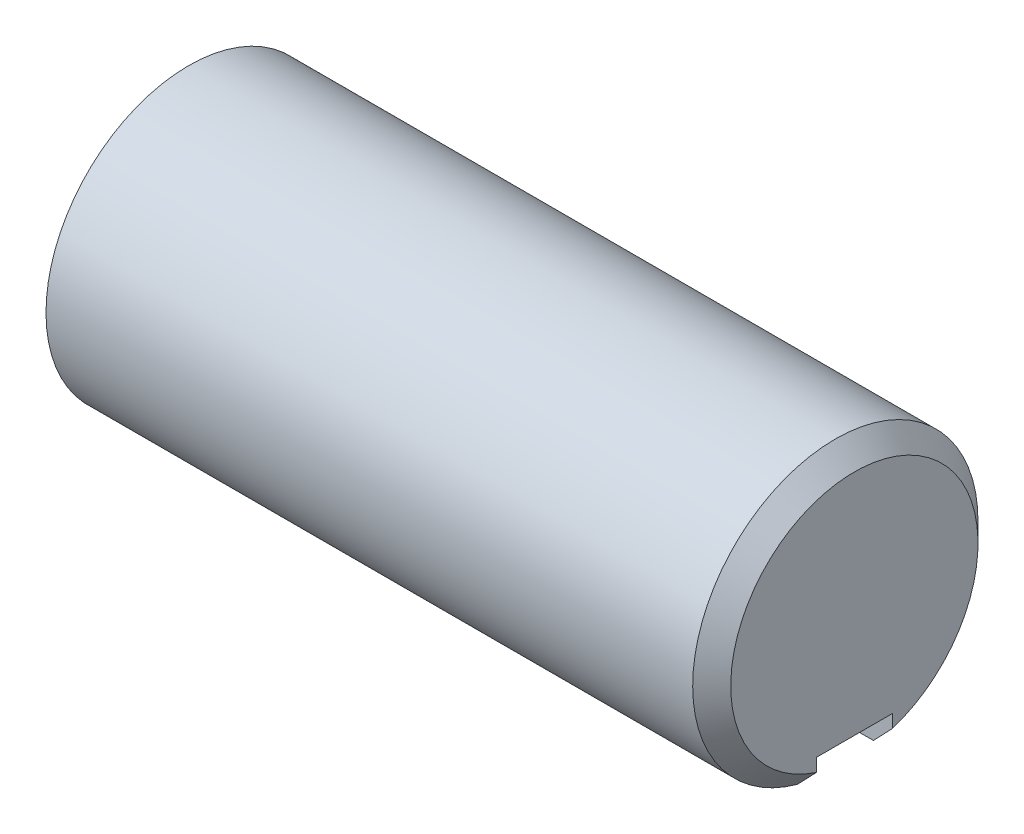
ISO-10303-21;
HEADER;
FILE_DESCRIPTION(('STEP AP214'),'2;1');
FILE_NAME('part.step','',(''),(''),'','','');
FILE_SCHEMA(('AUTOMOTIVE_DESIGN { 1 0 10303 214 1 1 1 1 }'));
ENDSEC;
DATA;
#1=APPLICATION_CONTEXT('core data for automotive mechanical design processes');
#2=APPLICATION_PROTOCOL_DEFINITION('international standard','automotive_design',2000,#1);
#3=PRODUCT_CONTEXT('',#1,'mechanical');
#4=PRODUCT('Part','Part','',(#3));
#5=PRODUCT_RELATED_PRODUCT_CATEGORY('part','',(#4));
#6=PRODUCT_DEFINITION_FORMATION('','',#4);
#7=PRODUCT_DEFINITION_CONTEXT('part definition',#1,'design');
#8=PRODUCT_DEFINITION('design','',#6,#7);
#9=PRODUCT_DEFINITION_SHAPE('','',#8);
#10=(LENGTH_UNIT() NAMED_UNIT(*) SI_UNIT(.MILLI.,.METRE.));
#11=(NAMED_UNIT(*) PLANE_ANGLE_UNIT() SI_UNIT($,.RADIAN.));
#12=(NAMED_UNIT(*) SI_UNIT($,.STERADIAN.) SOLID_ANGLE_UNIT());
#13=UNCERTAINTY_MEASURE_WITH_UNIT(LENGTH_MEASURE(1.E-05),#10,'distance_accuracy_value','');
#14=(GEOMETRIC_REPRESENTATION_CONTEXT(3) GLOBAL_UNCERTAINTY_ASSIGNED_CONTEXT((#13)) GLOBAL_UNIT_ASSIGNED_CONTEXT((#10,
#11,#12)) REPRESENTATION_CONTEXT('',''));
#15=CARTESIAN_POINT('',(0.,0.,0.));
#16=DIRECTION('',(0.,0.,1.));
#17=DIRECTION('',(1.,0.,0.));
#18=AXIS2_PLACEMENT_3D('',#15,#16,#17);
#19=CARTESIAN_POINT('',(432.152262189072,977.174064808057,20.));
#20=DIRECTION('',(1.,0.,0.));
#21=DIRECTION('',(0.,0.,1.));
#22=AXIS2_PLACEMENT_3D('',#19,#20,#21);
#23=PLANE('',#22);
#24=CARTESIAN_POINT('',(432.152262189072,978.254901583344,20.));
#25=DIRECTION('',(1.,0.,0.));
#26=DIRECTION('',(0.,-0.963788819653397,0.266666666666666));
#27=AXIS2_PLACEMENT_3D('',#24,#25,#26);
#28=CIRCLE('',#27,15.);
#29=CARTESIAN_POINT('',(432.152262189072,963.798069288543,24.));
#30=VERTEX_POINT('',#29);
#31=EDGE_CURVE('E11',#30,#30,#28,.T.);
#32=ORIENTED_EDGE('',*,*,#31,.F.);
#33=EDGE_LOOP('',(#32));
#34=FACE_BOUND('',#33,.T.);
#35=ADVANCED_FACE('F42',(#34),#23,.F.);
#36=CARTESIAN_POINT('',(432.152262189072,978.254901583344,20.));
#37=DIRECTION('',(-1.,0.,0.));
#38=DIRECTION('',(0.,-0.963788819653397,-0.266666666666669));
#39=AXIS2_PLACEMENT_3D('',#36,#37,#38);
#40=CYLINDRICAL_SURFACE('',#39,15.);
#41=ORIENTED_EDGE('',*,*,#31,.T.);
#42=EDGE_LOOP('',(#41));
#43=FACE_BOUND('',#42,.T.);
#44=CARTESIAN_POINT('',(500.152262189073,978.254901583344,20.));
#45=DIRECTION('',(1.,0.,0.));
#46=DIRECTION('',(0.,0.963788819653397,0.266666666666669));
#47=AXIS2_PLACEMENT_3D('',#44,#45,#46);
#48=CIRCLE('',#47,15.);
#49=CARTESIAN_POINT('',(500.152262189073,963.798069288543,16.));
#50=VERTEX_POINT('',#49);
#51=CARTESIAN_POINT('',(500.152262189073,963.798069288543,24.));
#52=VERTEX_POINT('',#51);
#53=EDGE_CURVE('E46',#50,#52,#48,.T.);
#54=ORIENTED_EDGE('',*,*,#53,.F.);
#55=DIRECTION('',(1.,0.,0.));
#56=VECTOR('',#55,1.);
#57=CARTESIAN_POINT('',(432.152262189072,963.798069288543,16.));
#58=LINE('',#57,#56);
#59=CARTESIAN_POINT('',(452.152262189073,963.798069288543,16.));
#60=VERTEX_POINT('',#59);
#61=EDGE_CURVE('E136',#60,#50,#58,.T.);
#62=ORIENTED_EDGE('',*,*,#61,.F.);
#63=CARTESIAN_POINT('',(452.152262189073,978.254901583344,20.));
#64=DIRECTION('',(1.,0.,0.));
#65=DIRECTION('',(0.,-0.963788819653397,0.266666666666666));
#66=AXIS2_PLACEMENT_3D('',#63,#64,#65);
#67=CIRCLE('',#66,15.);
#68=CARTESIAN_POINT('',(452.152262189073,963.798069288543,24.));
#69=VERTEX_POINT('',#68);
#70=EDGE_CURVE('E115',#69,#60,#67,.T.);
#71=ORIENTED_EDGE('',*,*,#70,.F.);
#72=DIRECTION('',(1.,0.,0.));
#73=VECTOR('',#72,1.);
#74=CARTESIAN_POINT('',(432.152262189072,963.798069288543,24.));
#75=LINE('',#74,#73);
#76=EDGE_CURVE('E52',#69,#52,#75,.T.);
#77=ORIENTED_EDGE('',*,*,#76,.T.);
#78=EDGE_LOOP('',(#54,#62,#71,#77));
#79=FACE_BOUND('',#78,.T.);
#80=ADVANCED_FACE('F44',(#43,#79),#40,.T.);
#81=CARTESIAN_POINT('',(432.152262189072,967.254901583344,24.));
#82=DIRECTION('',(0.,-1.,0.));
#83=DIRECTION('',(0.,0.,-1.));
#84=AXIS2_PLACEMENT_3D('',#81,#82,#83);
#85=PLANE('',#84);
#86=DIRECTION('',(0.,0.,1.));
#87=VECTOR('',#86,1.);
#88=CARTESIAN_POINT('',(454.152262189073,967.254901583344,22.));
#89=LINE('',#88,#87);
#90=CARTESIAN_POINT('',(454.152262189073,967.254901583344,16.));
#91=VERTEX_POINT('',#90);
#92=CARTESIAN_POINT('',(454.152262189073,967.254901583344,24.));
#93=VERTEX_POINT('',#92);
#94=EDGE_CURVE('E147',#91,#93,#89,.T.);
#95=ORIENTED_EDGE('',*,*,#94,.F.);
#96=DIRECTION('',(1.,0.,0.));
#97=VECTOR('',#96,1.);
#98=CARTESIAN_POINT('',(432.152262189072,967.254901583344,16.));
#99=LINE('',#98,#97);
#100=CARTESIAN_POINT('',(502.152262189073,967.254901583344,16.));
#101=VERTEX_POINT('',#100);
#102=EDGE_CURVE('E129',#91,#101,#99,.T.);
#103=ORIENTED_EDGE('',*,*,#102,.T.);
#104=DIRECTION('',(0.,0.,-1.));
#105=VECTOR('',#104,1.);
#106=CARTESIAN_POINT('',(502.152262189073,967.254901583344,24.));
#107=LINE('',#106,#105);
#108=CARTESIAN_POINT('',(502.152262189073,967.254901583344,24.));
#109=VERTEX_POINT('',#108);
#110=EDGE_CURVE('E102',#109,#101,#107,.T.);
#111=ORIENTED_EDGE('',*,*,#110,.F.);
#112=DIRECTION('',(1.,0.,0.));
#113=VECTOR('',#112,1.);
#114=CARTESIAN_POINT('',(432.152262189072,967.254901583344,24.));
#115=LINE('',#114,#113);
#116=EDGE_CURVE('E99',#93,#109,#115,.T.);
#117=ORIENTED_EDGE('',*,*,#116,.F.);
#118=EDGE_LOOP('',(#95,#103,#111,#117));
#119=FACE_BOUND('',#118,.T.);
#120=ADVANCED_FACE('F170',(#119),#85,.T.);
#121=CARTESIAN_POINT('',(432.152262189072,963.798069288543,24.));
#122=DIRECTION('',(0.,0.,-1.));
#123=DIRECTION('',(0.,1.,0.));
#124=AXIS2_PLACEMENT_3D('',#121,#122,#123);
#125=PLANE('',#124);
#126=CARTESIAN_POINT('',(454.152262189073,965.254901583344,24.));
#127=DIRECTION('',(0.,0.,-1.));
#128=DIRECTION('',(-0.707106781186548,0.707106781186548,0.));
#129=AXIS2_PLACEMENT_3D('',#126,#127,#128);
#130=CIRCLE('',#129,2.);
#131=CARTESIAN_POINT('',(452.152262189073,965.254901583344,24.));
#132=VERTEX_POINT('',#131);
#133=EDGE_CURVE('E123',#132,#93,#130,.T.);
#134=ORIENTED_EDGE('',*,*,#133,.T.);
#135=ORIENTED_EDGE('',*,*,#116,.T.);
#136=DIRECTION('',(0.,1.,0.));
#137=VECTOR('',#136,1.);
#138=CARTESIAN_POINT('',(502.152262189073,963.798069288543,24.));
#139=LINE('',#138,#137);
#140=CARTESIAN_POINT('',(502.152262189073,965.885584706491,24.));
#141=VERTEX_POINT('',#140);
#142=EDGE_CURVE('E93',#141,#109,#139,.T.);
#143=ORIENTED_EDGE('',*,*,#142,.F.);
#144=CARTESIAN_POINT('',(500.152262189073,963.798069288544,24.));
#145=CARTESIAN_POINT('',(501.230078628713,964.916381119582,24.));
#146=CARTESIAN_POINT('',(502.152262189073,965.885584706491,24.));
#147=(BOUNDED_CURVE() B_SPLINE_CURVE(2,(#144,#145,#146),.UNSPECIFIED.,.F.,
.F.) B_SPLINE_CURVE_WITH_KNOTS((3,3),(64.9361637614732,71.0682518353248),
.UNSPECIFIED.) CURVE() GEOMETRIC_REPRESENTATION_ITEM() RATIONAL_B_SPLINE_CURVE((1.05332774941701,
1.02918181261292,1.)) REPRESENTATION_ITEM(''));
#148=EDGE_CURVE('E98',#52,#141,#147,.T.);
#149=ORIENTED_EDGE('',*,*,#148,.F.);
#150=ORIENTED_EDGE('',*,*,#76,.F.);
#151=DIRECTION('',(0.,1.,0.));
#152=VECTOR('',#151,1.);
#153=CARTESIAN_POINT('',(452.152262189073,964.689275071157,24.));
#154=LINE('',#153,#152);
#155=EDGE_CURVE('E117',#69,#132,#154,.T.);
#156=ORIENTED_EDGE('',*,*,#155,.T.);
#157=EDGE_LOOP('',(#134,#135,#143,#149,#150,#156));
#158=FACE_BOUND('',#157,.T.);
#159=ADVANCED_FACE('F96',(#158),#125,.T.);
#160=CARTESIAN_POINT('',(502.152262189073,977.174064808057,20.));
#161=DIRECTION('',(1.,0.,0.));
#162=DIRECTION('',(0.,0.,1.));
#163=AXIS2_PLACEMENT_3D('',#160,#161,#162);
#164=PLANE('',#163);
#165=CARTESIAN_POINT('',(502.152262189073,978.254901583344,20.));
#166=DIRECTION('',(-1.,0.,0.));
#167=DIRECTION('',(0.,0.963788819653397,0.266666666666669));
#168=AXIS2_PLACEMENT_3D('',#165,#166,#167);
#169=CIRCLE('',#168,13.);
#170=CARTESIAN_POINT('',(502.152262189073,965.885584706491,16.));
#171=VERTEX_POINT('',#170);
#172=EDGE_CURVE('E105',#141,#171,#169,.T.);
#173=ORIENTED_EDGE('',*,*,#172,.F.);
#174=ORIENTED_EDGE('',*,*,#142,.T.);
#175=ORIENTED_EDGE('',*,*,#110,.T.);
#176=DIRECTION('',(0.,-1.,0.));
#177=VECTOR('',#176,1.);
#178=CARTESIAN_POINT('',(502.152262189073,967.254901583344,16.));
#179=LINE('',#178,#177);
#180=EDGE_CURVE('E108',#101,#171,#179,.T.);
#181=ORIENTED_EDGE('',*,*,#180,.T.);
#182=EDGE_LOOP('',(#173,#174,#175,#181));
#183=FACE_BOUND('',#182,.T.);
#184=ADVANCED_FACE('F106',(#183),#164,.T.);
#185=CARTESIAN_POINT('',(501.152262189073,978.254901583344,20.));
#186=DIRECTION('',(-1.,0.,0.));
#187=DIRECTION('',(0.,0.963788819653397,0.266666666666669));
#188=AXIS2_PLACEMENT_3D('',#185,#186,#187);
#189=CONICAL_SURFACE('',#188,14.,0.785398163397436);
#190=ORIENTED_EDGE('',*,*,#148,.T.);
#191=ORIENTED_EDGE('',*,*,#172,.T.);
#192=CARTESIAN_POINT('',(502.152262189073,965.885584706491,16.));
#193=CARTESIAN_POINT('',(501.230078628712,964.91638111958,16.));
#194=CARTESIAN_POINT('',(500.152262189072,963.798069288544,16.));
#195=(BOUNDED_CURVE() B_SPLINE_CURVE(2,(#192,#193,#194),.UNSPECIFIED.,.F.,
.F.) B_SPLINE_CURVE_WITH_KNOTS((3,3),(0.,6.13208807385683),
.UNSPECIFIED.) CURVE() GEOMETRIC_REPRESENTATION_ITEM() RATIONAL_B_SPLINE_CURVE((1.,
1.02918181261303,1.0533277494172)) REPRESENTATION_ITEM(''));
#196=EDGE_CURVE('E130',#171,#50,#195,.T.);
#197=ORIENTED_EDGE('',*,*,#196,.T.);
#198=ORIENTED_EDGE('',*,*,#53,.T.);
#199=EDGE_LOOP('',(#190,#191,#197,#198));
#200=FACE_BOUND('',#199,.T.);
#201=ADVANCED_FACE('F114',(#200),#189,.T.);
#202=CARTESIAN_POINT('',(452.152262189073,965.58048085377,20.));
#203=DIRECTION('',(1.,0.,0.));
#204=DIRECTION('',(0.,0.,1.));
#205=AXIS2_PLACEMENT_3D('',#202,#203,#204);
#206=PLANE('',#205);
#207=DIRECTION('',(0.,0.,-1.));
#208=VECTOR('',#207,1.);
#209=CARTESIAN_POINT('',(452.152262189073,965.254901583344,22.));
#210=LINE('',#209,#208);
#211=CARTESIAN_POINT('',(452.152262189073,965.254901583344,16.));
#212=VERTEX_POINT('',#211);
#213=EDGE_CURVE('E137',#132,#212,#210,.T.);
#214=ORIENTED_EDGE('',*,*,#213,.F.);
#215=ORIENTED_EDGE('',*,*,#155,.F.);
#216=ORIENTED_EDGE('',*,*,#70,.T.);
#217=DIRECTION('',(0.,-1.,0.));
#218=VECTOR('',#217,1.);
#219=CARTESIAN_POINT('',(452.152262189073,966.417691218557,16.));
#220=LINE('',#219,#218);
#221=EDGE_CURVE('E133',#212,#60,#220,.T.);
#222=ORIENTED_EDGE('',*,*,#221,.F.);
#223=EDGE_LOOP('',(#214,#215,#216,#222));
#224=FACE_BOUND('',#223,.T.);
#225=ADVANCED_FACE('F164',(#224),#206,.T.);
#226=CARTESIAN_POINT('',(432.152262189072,967.254901583344,16.));
#227=DIRECTION('',(0.,0.,1.));
#228=DIRECTION('',(0.,-1.,0.));
#229=AXIS2_PLACEMENT_3D('',#226,#227,#228);
#230=PLANE('',#229);
#231=CARTESIAN_POINT('',(454.152262189073,965.254901583344,16.));
#232=DIRECTION('',(0.,0.,1.));
#233=DIRECTION('',(-0.707106781186548,0.707106781186548,0.));
#234=AXIS2_PLACEMENT_3D('',#231,#232,#233);
#235=CIRCLE('',#234,2.);
#236=EDGE_CURVE('E145',#91,#212,#235,.T.);
#237=ORIENTED_EDGE('',*,*,#236,.T.);
#238=ORIENTED_EDGE('',*,*,#221,.T.);
#239=ORIENTED_EDGE('',*,*,#61,.T.);
#240=ORIENTED_EDGE('',*,*,#196,.F.);
#241=ORIENTED_EDGE('',*,*,#180,.F.);
#242=ORIENTED_EDGE('',*,*,#102,.F.);
#243=EDGE_LOOP('',(#237,#238,#239,#240,#241,#242));
#244=FACE_BOUND('',#243,.T.);
#245=ADVANCED_FACE('F167',(#244),#230,.T.);
#246=CARTESIAN_POINT('',(454.152262189073,965.254901583344,22.));
#247=DIRECTION('',(0.,0.,1.));
#248=DIRECTION('',(-0.707106781186548,0.707106781186548,0.));
#249=AXIS2_PLACEMENT_3D('',#246,#247,#248);
#250=CYLINDRICAL_SURFACE('',#249,2.);
#251=ORIENTED_EDGE('',*,*,#236,.F.);
#252=ORIENTED_EDGE('',*,*,#94,.T.);
#253=ORIENTED_EDGE('',*,*,#133,.F.);
#254=ORIENTED_EDGE('',*,*,#213,.T.);
#255=EDGE_LOOP('',(#251,#252,#253,#254));
#256=FACE_BOUND('',#255,.T.);
#257=ADVANCED_FACE('F161',(#256),#250,.F.);
#258=CLOSED_SHELL('',(#35,#80,#120,#159,#184,#201,#225,#245,#257));
#259=MANIFOLD_SOLID_BREP('B2',#258);
#260=ADVANCED_BREP_SHAPE_REPRESENTATION('',(#18,#259),#14);
#261=SHAPE_DEFINITION_REPRESENTATION(#9,#260);
ENDSEC;
END-ISO-10303-21;
